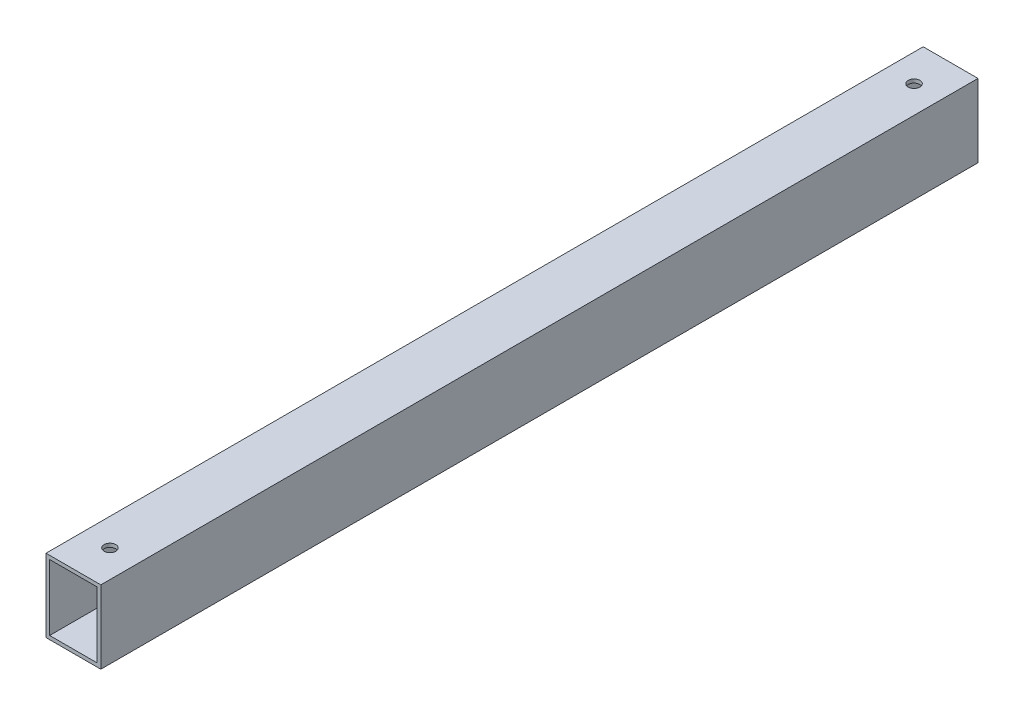
ISO-10303-21;
HEADER;
FILE_DESCRIPTION(('STEP AP214'),'2;1');
FILE_NAME('part.step','',(''),(''),'','','');
FILE_SCHEMA(('AUTOMOTIVE_DESIGN { 1 0 10303 214 1 1 1 1 }'));
ENDSEC;
DATA;
#1=APPLICATION_CONTEXT('core data for automotive mechanical design processes');
#2=APPLICATION_PROTOCOL_DEFINITION('international standard','automotive_design',2000,#1);
#3=PRODUCT_CONTEXT('',#1,'mechanical');
#4=PRODUCT('Part','Part','',(#3));
#5=PRODUCT_RELATED_PRODUCT_CATEGORY('part','',(#4));
#6=PRODUCT_DEFINITION_FORMATION('','',#4);
#7=PRODUCT_DEFINITION_CONTEXT('part definition',#1,'design');
#8=PRODUCT_DEFINITION('design','',#6,#7);
#9=PRODUCT_DEFINITION_SHAPE('','',#8);
#10=(LENGTH_UNIT() NAMED_UNIT(*) SI_UNIT(.MILLI.,.METRE.));
#11=(NAMED_UNIT(*) PLANE_ANGLE_UNIT() SI_UNIT($,.RADIAN.));
#12=(NAMED_UNIT(*) SI_UNIT($,.STERADIAN.) SOLID_ANGLE_UNIT());
#13=UNCERTAINTY_MEASURE_WITH_UNIT(LENGTH_MEASURE(1.E-05),#10,'distance_accuracy_value','');
#14=(GEOMETRIC_REPRESENTATION_CONTEXT(3) GLOBAL_UNCERTAINTY_ASSIGNED_CONTEXT((#13)) GLOBAL_UNIT_ASSIGNED_CONTEXT((#10,
#11,#12)) REPRESENTATION_CONTEXT('',''));
#15=CARTESIAN_POINT('',(0.,0.,0.));
#16=DIRECTION('',(0.,0.,1.));
#17=DIRECTION('',(1.,0.,0.));
#18=AXIS2_PLACEMENT_3D('',#15,#16,#17);
#19=CARTESIAN_POINT('',(0.,0.,240.));
#20=DIRECTION('',(0.,0.,1.));
#21=DIRECTION('',(1.,0.,0.));
#22=AXIS2_PLACEMENT_3D('',#19,#20,#21);
#23=PLANE('',#22);
#24=DIRECTION('',(0.,-1.,0.));
#25=VECTOR('',#24,1.);
#26=CARTESIAN_POINT('',(0.,0.,240.));
#27=LINE('',#26,#25);
#28=CARTESIAN_POINT('',(0.,0.,240.));
#29=VERTEX_POINT('',#28);
#30=CARTESIAN_POINT('',(0.,-20.,240.));
#31=VERTEX_POINT('',#30);
#32=EDGE_CURVE('E170',#29,#31,#27,.T.);
#33=ORIENTED_EDGE('',*,*,#32,.T.);
#34=DIRECTION('',(1.,0.,0.));
#35=VECTOR('',#34,1.);
#36=CARTESIAN_POINT('',(0.,-20.,240.));
#37=LINE('',#36,#35);
#38=CARTESIAN_POINT('',(15.,-20.,240.));
#39=VERTEX_POINT('',#38);
#40=EDGE_CURVE('E173',#31,#39,#37,.T.);
#41=ORIENTED_EDGE('',*,*,#40,.T.);
#42=DIRECTION('',(0.,1.,0.));
#43=VECTOR('',#42,1.);
#44=CARTESIAN_POINT('',(15.,0.,240.));
#45=LINE('',#44,#43);
#46=CARTESIAN_POINT('',(15.,0.,240.));
#47=VERTEX_POINT('',#46);
#48=EDGE_CURVE('E176',#39,#47,#45,.T.);
#49=ORIENTED_EDGE('',*,*,#48,.T.);
#50=DIRECTION('',(-1.,0.,0.));
#51=VECTOR('',#50,1.);
#52=CARTESIAN_POINT('',(0.,0.,240.));
#53=LINE('',#52,#51);
#54=EDGE_CURVE('E178',#47,#29,#53,.T.);
#55=ORIENTED_EDGE('',*,*,#54,.T.);
#56=EDGE_LOOP('',(#33,#41,#49,#55));
#57=FACE_BOUND('',#56,.T.);
#58=DIRECTION('',(1.,0.,0.));
#59=VECTOR('',#58,1.);
#60=CARTESIAN_POINT('',(0.,-19.,240.));
#61=LINE('',#60,#59);
#62=CARTESIAN_POINT('',(1.,-19.,240.));
#63=VERTEX_POINT('',#62);
#64=CARTESIAN_POINT('',(14.,-19.,240.));
#65=VERTEX_POINT('',#64);
#66=EDGE_CURVE('E140',#63,#65,#61,.T.);
#67=ORIENTED_EDGE('',*,*,#66,.F.);
#68=DIRECTION('',(0.,-1.,0.));
#69=VECTOR('',#68,1.);
#70=CARTESIAN_POINT('',(1.,0.,240.));
#71=LINE('',#70,#69);
#72=CARTESIAN_POINT('',(1.,-1.,240.));
#73=VERTEX_POINT('',#72);
#74=EDGE_CURVE('E132',#73,#63,#71,.T.);
#75=ORIENTED_EDGE('',*,*,#74,.F.);
#76=DIRECTION('',(-1.,0.,0.));
#77=VECTOR('',#76,1.);
#78=CARTESIAN_POINT('',(0.,-1.,240.));
#79=LINE('',#78,#77);
#80=CARTESIAN_POINT('',(14.,-1.,240.));
#81=VERTEX_POINT('',#80);
#82=EDGE_CURVE('E154',#81,#73,#79,.T.);
#83=ORIENTED_EDGE('',*,*,#82,.F.);
#84=DIRECTION('',(0.,1.,0.));
#85=VECTOR('',#84,1.);
#86=CARTESIAN_POINT('',(14.,0.,240.));
#87=LINE('',#86,#85);
#88=EDGE_CURVE('E152',#65,#81,#87,.T.);
#89=ORIENTED_EDGE('',*,*,#88,.F.);
#90=EDGE_LOOP('',(#67,#75,#83,#89));
#91=FACE_BOUND('',#90,.T.);
#92=ADVANCED_FACE('F65',(#57,#91),#23,.T.);
#93=CARTESIAN_POINT('',(0.,0.,0.));
#94=DIRECTION('',(0.,0.,1.));
#95=DIRECTION('',(1.,0.,0.));
#96=AXIS2_PLACEMENT_3D('',#93,#94,#95);
#97=PLANE('',#96);
#98=DIRECTION('',(0.,-1.,0.));
#99=VECTOR('',#98,1.);
#100=CARTESIAN_POINT('',(0.,0.,0.));
#101=LINE('',#100,#99);
#102=CARTESIAN_POINT('',(0.,0.,0.));
#103=VERTEX_POINT('',#102);
#104=CARTESIAN_POINT('',(0.,-20.,0.));
#105=VERTEX_POINT('',#104);
#106=EDGE_CURVE('E148',#103,#105,#101,.T.);
#107=ORIENTED_EDGE('',*,*,#106,.F.);
#108=DIRECTION('',(-1.,0.,0.));
#109=VECTOR('',#108,1.);
#110=CARTESIAN_POINT('',(0.,0.,0.));
#111=LINE('',#110,#109);
#112=CARTESIAN_POINT('',(15.,0.,0.));
#113=VERTEX_POINT('',#112);
#114=EDGE_CURVE('E174',#113,#103,#111,.T.);
#115=ORIENTED_EDGE('',*,*,#114,.F.);
#116=DIRECTION('',(0.,1.,0.));
#117=VECTOR('',#116,1.);
#118=CARTESIAN_POINT('',(15.,0.,0.));
#119=LINE('',#118,#117);
#120=CARTESIAN_POINT('',(15.,-20.,0.));
#121=VERTEX_POINT('',#120);
#122=EDGE_CURVE('E185',#121,#113,#119,.T.);
#123=ORIENTED_EDGE('',*,*,#122,.F.);
#124=DIRECTION('',(1.,0.,0.));
#125=VECTOR('',#124,1.);
#126=CARTESIAN_POINT('',(0.,-20.,0.));
#127=LINE('',#126,#125);
#128=EDGE_CURVE('E183',#105,#121,#127,.T.);
#129=ORIENTED_EDGE('',*,*,#128,.F.);
#130=EDGE_LOOP('',(#107,#115,#123,#129));
#131=FACE_BOUND('',#130,.T.);
#132=DIRECTION('',(0.,-1.,0.));
#133=VECTOR('',#132,1.);
#134=CARTESIAN_POINT('',(1.,0.,0.));
#135=LINE('',#134,#133);
#136=CARTESIAN_POINT('',(1.,-1.,0.));
#137=VERTEX_POINT('',#136);
#138=CARTESIAN_POINT('',(1.,-19.,0.));
#139=VERTEX_POINT('',#138);
#140=EDGE_CURVE('E90',#137,#139,#135,.T.);
#141=ORIENTED_EDGE('',*,*,#140,.T.);
#142=DIRECTION('',(1.,0.,0.));
#143=VECTOR('',#142,1.);
#144=CARTESIAN_POINT('',(0.,-19.,0.));
#145=LINE('',#144,#143);
#146=CARTESIAN_POINT('',(14.,-19.,0.));
#147=VERTEX_POINT('',#146);
#148=EDGE_CURVE('E147',#139,#147,#145,.T.);
#149=ORIENTED_EDGE('',*,*,#148,.T.);
#150=DIRECTION('',(0.,1.,0.));
#151=VECTOR('',#150,1.);
#152=CARTESIAN_POINT('',(14.,0.,0.));
#153=LINE('',#152,#151);
#154=CARTESIAN_POINT('',(14.,-1.,0.));
#155=VERTEX_POINT('',#154);
#156=EDGE_CURVE('E162',#147,#155,#153,.T.);
#157=ORIENTED_EDGE('',*,*,#156,.T.);
#158=DIRECTION('',(-1.,0.,0.));
#159=VECTOR('',#158,1.);
#160=CARTESIAN_POINT('',(0.,-1.,0.));
#161=LINE('',#160,#159);
#162=EDGE_CURVE('E141',#155,#137,#161,.T.);
#163=ORIENTED_EDGE('',*,*,#162,.T.);
#164=EDGE_LOOP('',(#141,#149,#157,#163));
#165=FACE_BOUND('',#164,.T.);
#166=ADVANCED_FACE('F232',(#131,#165),#97,.F.);
#167=CARTESIAN_POINT('',(0.,0.,240.));
#168=DIRECTION('',(1.,0.,0.));
#169=DIRECTION('',(0.,1.,0.));
#170=AXIS2_PLACEMENT_3D('',#167,#168,#169);
#171=PLANE('',#170);
#172=ORIENTED_EDGE('',*,*,#106,.T.);
#173=DIRECTION('',(0.,0.,-1.));
#174=VECTOR('',#173,1.);
#175=CARTESIAN_POINT('',(0.,-20.,240.));
#176=LINE('',#175,#174);
#177=EDGE_CURVE('E12',#31,#105,#176,.T.);
#178=ORIENTED_EDGE('',*,*,#177,.F.);
#179=ORIENTED_EDGE('',*,*,#32,.F.);
#180=DIRECTION('',(0.,0.,-1.));
#181=VECTOR('',#180,1.);
#182=CARTESIAN_POINT('',(0.,0.,240.));
#183=LINE('',#182,#181);
#184=EDGE_CURVE('E180',#29,#103,#183,.T.);
#185=ORIENTED_EDGE('',*,*,#184,.T.);
#186=EDGE_LOOP('',(#172,#178,#179,#185));
#187=FACE_BOUND('',#186,.T.);
#188=ADVANCED_FACE('F67',(#187),#171,.F.);
#189=CARTESIAN_POINT('',(0.,-20.,240.));
#190=DIRECTION('',(0.,1.,0.));
#191=DIRECTION('',(0.,0.,1.));
#192=AXIS2_PLACEMENT_3D('',#189,#190,#191);
#193=PLANE('',#192);
#194=CARTESIAN_POINT('',(7.5,-20.,10.));
#195=DIRECTION('',(0.,1.,0.));
#196=DIRECTION('',(0.,0.,1.));
#197=AXIS2_PLACEMENT_3D('',#194,#195,#196);
#198=CIRCLE('',#197,1.6);
#199=CARTESIAN_POINT('',(7.5,-20.,11.6));
#200=VERTEX_POINT('',#199);
#201=EDGE_CURVE('E197',#200,#200,#198,.T.);
#202=ORIENTED_EDGE('',*,*,#201,.T.);
#203=EDGE_LOOP('',(#202));
#204=FACE_BOUND('',#203,.T.);
#205=CARTESIAN_POINT('',(7.5,-20.,230.));
#206=DIRECTION('',(0.,1.,0.));
#207=DIRECTION('',(0.,0.,1.));
#208=AXIS2_PLACEMENT_3D('',#205,#206,#207);
#209=CIRCLE('',#208,1.6);
#210=CARTESIAN_POINT('',(7.5,-20.,231.6));
#211=VERTEX_POINT('',#210);
#212=EDGE_CURVE('E213',#211,#211,#209,.T.);
#213=ORIENTED_EDGE('',*,*,#212,.T.);
#214=EDGE_LOOP('',(#213));
#215=FACE_BOUND('',#214,.T.);
#216=ORIENTED_EDGE('',*,*,#128,.T.);
#217=DIRECTION('',(0.,0.,-1.));
#218=VECTOR('',#217,1.);
#219=CARTESIAN_POINT('',(15.,-20.,240.));
#220=LINE('',#219,#218);
#221=EDGE_CURVE('E74',#39,#121,#220,.T.);
#222=ORIENTED_EDGE('',*,*,#221,.F.);
#223=ORIENTED_EDGE('',*,*,#40,.F.);
#224=ORIENTED_EDGE('',*,*,#177,.T.);
#225=EDGE_LOOP('',(#216,#222,#223,#224));
#226=FACE_BOUND('',#225,.T.);
#227=ADVANCED_FACE('F259',(#204,#215,#226),#193,.F.);
#228=CARTESIAN_POINT('',(15.,0.,240.));
#229=DIRECTION('',(-1.,0.,0.));
#230=DIRECTION('',(0.,-1.,0.));
#231=AXIS2_PLACEMENT_3D('',#228,#229,#230);
#232=PLANE('',#231);
#233=ORIENTED_EDGE('',*,*,#122,.T.);
#234=DIRECTION('',(0.,0.,-1.));
#235=VECTOR('',#234,1.);
#236=CARTESIAN_POINT('',(15.,0.,240.));
#237=LINE('',#236,#235);
#238=EDGE_CURVE('E190',#47,#113,#237,.T.);
#239=ORIENTED_EDGE('',*,*,#238,.F.);
#240=ORIENTED_EDGE('',*,*,#48,.F.);
#241=ORIENTED_EDGE('',*,*,#221,.T.);
#242=EDGE_LOOP('',(#233,#239,#240,#241));
#243=FACE_BOUND('',#242,.T.);
#244=ADVANCED_FACE('F256',(#243),#232,.F.);
#245=CARTESIAN_POINT('',(0.,0.,240.));
#246=DIRECTION('',(0.,-1.,0.));
#247=DIRECTION('',(0.,0.,-1.));
#248=AXIS2_PLACEMENT_3D('',#245,#246,#247);
#249=PLANE('',#248);
#250=CARTESIAN_POINT('',(7.5,0.,10.));
#251=DIRECTION('',(0.,1.,0.));
#252=DIRECTION('',(0.,0.,1.));
#253=AXIS2_PLACEMENT_3D('',#250,#251,#252);
#254=CIRCLE('',#253,1.6);
#255=CARTESIAN_POINT('',(7.5,0.,11.6));
#256=VERTEX_POINT('',#255);
#257=EDGE_CURVE('E203',#256,#256,#254,.T.);
#258=ORIENTED_EDGE('',*,*,#257,.F.);
#259=EDGE_LOOP('',(#258));
#260=FACE_BOUND('',#259,.T.);
#261=CARTESIAN_POINT('',(7.5,0.,230.));
#262=DIRECTION('',(0.,1.,0.));
#263=DIRECTION('',(0.,0.,1.));
#264=AXIS2_PLACEMENT_3D('',#261,#262,#263);
#265=CIRCLE('',#264,1.6);
#266=CARTESIAN_POINT('',(7.5,0.,231.6));
#267=VERTEX_POINT('',#266);
#268=EDGE_CURVE('E208',#267,#267,#265,.T.);
#269=ORIENTED_EDGE('',*,*,#268,.F.);
#270=EDGE_LOOP('',(#269));
#271=FACE_BOUND('',#270,.T.);
#272=ORIENTED_EDGE('',*,*,#114,.T.);
#273=ORIENTED_EDGE('',*,*,#184,.F.);
#274=ORIENTED_EDGE('',*,*,#54,.F.);
#275=ORIENTED_EDGE('',*,*,#238,.T.);
#276=EDGE_LOOP('',(#272,#273,#274,#275));
#277=FACE_BOUND('',#276,.T.);
#278=ADVANCED_FACE('F253',(#260,#271,#277),#249,.F.);
#279=CARTESIAN_POINT('',(1.,0.,240.));
#280=DIRECTION('',(1.,0.,0.));
#281=DIRECTION('',(0.,1.,0.));
#282=AXIS2_PLACEMENT_3D('',#279,#280,#281);
#283=PLANE('',#282);
#284=ORIENTED_EDGE('',*,*,#140,.F.);
#285=DIRECTION('',(0.,0.,-1.));
#286=VECTOR('',#285,1.);
#287=CARTESIAN_POINT('',(1.,-1.,240.));
#288=LINE('',#287,#286);
#289=EDGE_CURVE('E136',#73,#137,#288,.T.);
#290=ORIENTED_EDGE('',*,*,#289,.F.);
#291=ORIENTED_EDGE('',*,*,#74,.T.);
#292=DIRECTION('',(0.,0.,-1.));
#293=VECTOR('',#292,1.);
#294=CARTESIAN_POINT('',(1.,-19.,240.));
#295=LINE('',#294,#293);
#296=EDGE_CURVE('E135',#63,#139,#295,.T.);
#297=ORIENTED_EDGE('',*,*,#296,.T.);
#298=EDGE_LOOP('',(#284,#290,#291,#297));
#299=FACE_BOUND('',#298,.T.);
#300=ADVANCED_FACE('F134',(#299),#283,.T.);
#301=CARTESIAN_POINT('',(0.,-19.,240.));
#302=DIRECTION('',(0.,1.,0.));
#303=DIRECTION('',(0.,0.,1.));
#304=AXIS2_PLACEMENT_3D('',#301,#302,#303);
#305=PLANE('',#304);
#306=CARTESIAN_POINT('',(7.5,-19.,10.));
#307=DIRECTION('',(0.,1.,0.));
#308=DIRECTION('',(0.,0.,1.));
#309=AXIS2_PLACEMENT_3D('',#306,#307,#308);
#310=CIRCLE('',#309,1.6);
#311=CARTESIAN_POINT('',(7.5,-19.,11.6));
#312=VERTEX_POINT('',#311);
#313=EDGE_CURVE('E160',#312,#312,#310,.T.);
#314=ORIENTED_EDGE('',*,*,#313,.F.);
#315=EDGE_LOOP('',(#314));
#316=FACE_BOUND('',#315,.T.);
#317=CARTESIAN_POINT('',(7.5,-19.,230.));
#318=DIRECTION('',(0.,1.,0.));
#319=DIRECTION('',(0.,0.,1.));
#320=AXIS2_PLACEMENT_3D('',#317,#318,#319);
#321=CIRCLE('',#320,1.6);
#322=CARTESIAN_POINT('',(7.5,-19.,231.6));
#323=VERTEX_POINT('',#322);
#324=EDGE_CURVE('E196',#323,#323,#321,.T.);
#325=ORIENTED_EDGE('',*,*,#324,.F.);
#326=EDGE_LOOP('',(#325));
#327=FACE_BOUND('',#326,.T.);
#328=ORIENTED_EDGE('',*,*,#148,.F.);
#329=ORIENTED_EDGE('',*,*,#296,.F.);
#330=ORIENTED_EDGE('',*,*,#66,.T.);
#331=DIRECTION('',(0.,0.,-1.));
#332=VECTOR('',#331,1.);
#333=CARTESIAN_POINT('',(14.,-19.,240.));
#334=LINE('',#333,#332);
#335=EDGE_CURVE('E149',#65,#147,#334,.T.);
#336=ORIENTED_EDGE('',*,*,#335,.T.);
#337=EDGE_LOOP('',(#328,#329,#330,#336));
#338=FACE_BOUND('',#337,.T.);
#339=ADVANCED_FACE('F144',(#316,#327,#338),#305,.T.);
#340=CARTESIAN_POINT('',(14.,0.,240.));
#341=DIRECTION('',(-1.,0.,0.));
#342=DIRECTION('',(0.,-1.,0.));
#343=AXIS2_PLACEMENT_3D('',#340,#341,#342);
#344=PLANE('',#343);
#345=ORIENTED_EDGE('',*,*,#156,.F.);
#346=ORIENTED_EDGE('',*,*,#335,.F.);
#347=ORIENTED_EDGE('',*,*,#88,.T.);
#348=DIRECTION('',(0.,0.,-1.));
#349=VECTOR('',#348,1.);
#350=CARTESIAN_POINT('',(14.,-1.,240.));
#351=LINE('',#350,#349);
#352=EDGE_CURVE('E82',#81,#155,#351,.T.);
#353=ORIENTED_EDGE('',*,*,#352,.T.);
#354=EDGE_LOOP('',(#345,#346,#347,#353));
#355=FACE_BOUND('',#354,.T.);
#356=ADVANCED_FACE('F228',(#355),#344,.T.);
#357=CARTESIAN_POINT('',(0.,-1.,240.));
#358=DIRECTION('',(0.,-1.,0.));
#359=DIRECTION('',(0.,0.,-1.));
#360=AXIS2_PLACEMENT_3D('',#357,#358,#359);
#361=PLANE('',#360);
#362=CARTESIAN_POINT('',(7.5,-1.,10.));
#363=DIRECTION('',(0.,-1.,0.));
#364=DIRECTION('',(0.,0.,-1.));
#365=AXIS2_PLACEMENT_3D('',#362,#363,#364);
#366=CIRCLE('',#365,1.6);
#367=CARTESIAN_POINT('',(7.5,-1.,8.40000000000001));
#368=VERTEX_POINT('',#367);
#369=EDGE_CURVE('E69',#368,#368,#366,.T.);
#370=ORIENTED_EDGE('',*,*,#369,.F.);
#371=EDGE_LOOP('',(#370));
#372=FACE_BOUND('',#371,.T.);
#373=CARTESIAN_POINT('',(7.5,-1.,230.));
#374=DIRECTION('',(0.,-1.,0.));
#375=DIRECTION('',(0.,0.,-1.));
#376=AXIS2_PLACEMENT_3D('',#373,#374,#375);
#377=CIRCLE('',#376,1.6);
#378=CARTESIAN_POINT('',(7.5,-1.,228.4));
#379=VERTEX_POINT('',#378);
#380=EDGE_CURVE('E194',#379,#379,#377,.T.);
#381=ORIENTED_EDGE('',*,*,#380,.F.);
#382=EDGE_LOOP('',(#381));
#383=FACE_BOUND('',#382,.T.);
#384=ORIENTED_EDGE('',*,*,#162,.F.);
#385=ORIENTED_EDGE('',*,*,#352,.F.);
#386=ORIENTED_EDGE('',*,*,#82,.T.);
#387=ORIENTED_EDGE('',*,*,#289,.T.);
#388=EDGE_LOOP('',(#384,#385,#386,#387));
#389=FACE_BOUND('',#388,.T.);
#390=ADVANCED_FACE('F224',(#372,#383,#389),#361,.T.);
#391=CARTESIAN_POINT('',(7.5,-20.,230.));
#392=DIRECTION('',(0.,1.,0.));
#393=DIRECTION('',(0.,0.,1.));
#394=AXIS2_PLACEMENT_3D('',#391,#392,#393);
#395=CYLINDRICAL_SURFACE('',#394,1.6);
#396=ORIENTED_EDGE('',*,*,#380,.T.);
#397=EDGE_LOOP('',(#396));
#398=FACE_BOUND('',#397,.T.);
#399=ORIENTED_EDGE('',*,*,#268,.T.);
#400=EDGE_LOOP('',(#399));
#401=FACE_BOUND('',#400,.T.);
#402=ADVANCED_FACE('F227',(#398,#401),#395,.F.);
#403=CARTESIAN_POINT('',(7.5,-20.,10.));
#404=DIRECTION('',(0.,1.,0.));
#405=DIRECTION('',(0.,0.,1.));
#406=AXIS2_PLACEMENT_3D('',#403,#404,#405);
#407=CYLINDRICAL_SURFACE('',#406,1.6);
#408=ORIENTED_EDGE('',*,*,#369,.T.);
#409=EDGE_LOOP('',(#408));
#410=FACE_BOUND('',#409,.T.);
#411=ORIENTED_EDGE('',*,*,#257,.T.);
#412=EDGE_LOOP('',(#411));
#413=FACE_BOUND('',#412,.T.);
#414=ADVANCED_FACE('F221',(#410,#413),#407,.F.);
#415=ORIENTED_EDGE('',*,*,#324,.T.);
#416=EDGE_LOOP('',(#415));
#417=FACE_BOUND('',#416,.T.);
#418=ORIENTED_EDGE('',*,*,#212,.F.);
#419=EDGE_LOOP('',(#418));
#420=FACE_BOUND('',#419,.T.);
#421=ADVANCED_FACE('F280',(#417,#420),#395,.F.);
#422=ORIENTED_EDGE('',*,*,#313,.T.);
#423=EDGE_LOOP('',(#422));
#424=FACE_BOUND('',#423,.T.);
#425=ORIENTED_EDGE('',*,*,#201,.F.);
#426=EDGE_LOOP('',(#425));
#427=FACE_BOUND('',#426,.T.);
#428=ADVANCED_FACE('F282',(#424,#427),#407,.F.);
#429=CLOSED_SHELL('',(#92,#166,#188,#227,#244,#278,#300,#339,#356,#390,#402,#414,#421,#428));
#430=MANIFOLD_SOLID_BREP('B2',#429);
#431=ADVANCED_BREP_SHAPE_REPRESENTATION('',(#18,#430),#14);
#432=SHAPE_DEFINITION_REPRESENTATION(#9,#431);
ENDSEC;
END-ISO-10303-21;
